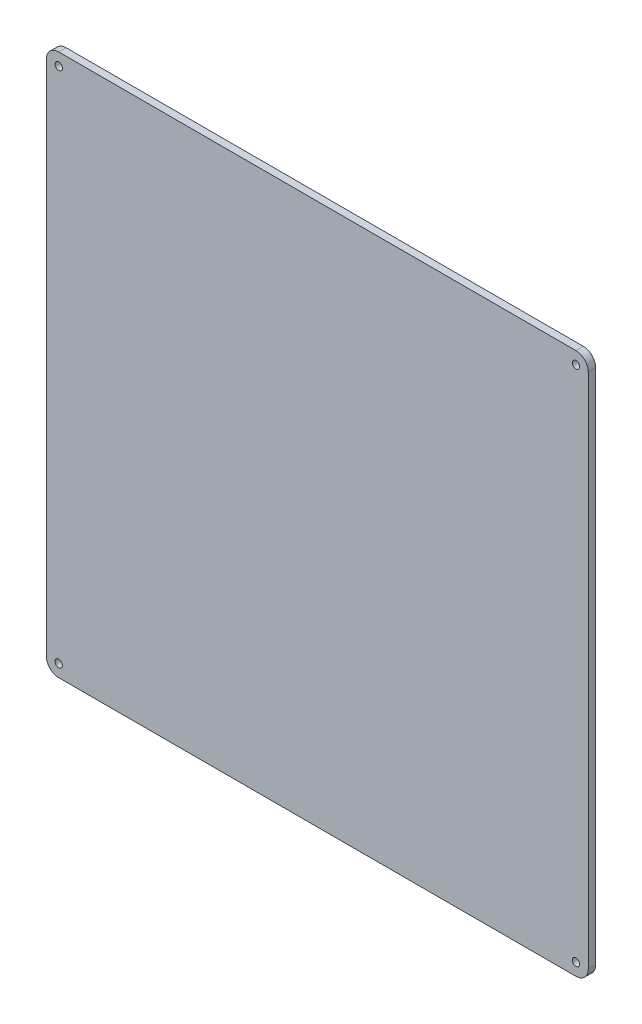
ISO-10303-21;
HEADER;
FILE_DESCRIPTION(('STEP AP214'),'2;1');
FILE_NAME('part.step','',(''),(''),'','','');
FILE_SCHEMA(('AUTOMOTIVE_DESIGN { 1 0 10303 214 1 1 1 1 }'));
ENDSEC;
DATA;
#1=APPLICATION_CONTEXT('core data for automotive mechanical design processes');
#2=APPLICATION_PROTOCOL_DEFINITION('international standard','automotive_design',2000,#1);
#3=PRODUCT_CONTEXT('',#1,'mechanical');
#4=PRODUCT('Part','Part','',(#3));
#5=PRODUCT_RELATED_PRODUCT_CATEGORY('part','',(#4));
#6=PRODUCT_DEFINITION_FORMATION('','',#4);
#7=PRODUCT_DEFINITION_CONTEXT('part definition',#1,'design');
#8=PRODUCT_DEFINITION('design','',#6,#7);
#9=PRODUCT_DEFINITION_SHAPE('','',#8);
#10=(LENGTH_UNIT() NAMED_UNIT(*) SI_UNIT(.MILLI.,.METRE.));
#11=(NAMED_UNIT(*) PLANE_ANGLE_UNIT() SI_UNIT($,.RADIAN.));
#12=(NAMED_UNIT(*) SI_UNIT($,.STERADIAN.) SOLID_ANGLE_UNIT());
#13=UNCERTAINTY_MEASURE_WITH_UNIT(LENGTH_MEASURE(1.E-05),#10,'distance_accuracy_value','');
#14=(GEOMETRIC_REPRESENTATION_CONTEXT(3) GLOBAL_UNCERTAINTY_ASSIGNED_CONTEXT((#13)) GLOBAL_UNIT_ASSIGNED_CONTEXT((#10,
#11,#12)) REPRESENTATION_CONTEXT('',''));
#15=CARTESIAN_POINT('',(0.,0.,0.));
#16=DIRECTION('',(0.,0.,1.));
#17=DIRECTION('',(1.,0.,0.));
#18=AXIS2_PLACEMENT_3D('',#15,#16,#17);
#19=CARTESIAN_POINT('',(110.,-110.,3.));
#20=DIRECTION('',(-1.,0.,0.));
#21=DIRECTION('',(0.,0.,1.));
#22=AXIS2_PLACEMENT_3D('',#19,#20,#21);
#23=PLANE('',#22);
#24=DIRECTION('',(0.,1.,0.));
#25=VECTOR('',#24,1.);
#26=CARTESIAN_POINT('',(110.,-110.,3.));
#27=LINE('',#26,#25);
#28=CARTESIAN_POINT('',(110.,-105.,3.));
#29=VERTEX_POINT('',#28);
#30=CARTESIAN_POINT('',(110.,105.,3.));
#31=VERTEX_POINT('',#30);
#32=EDGE_CURVE('E126',#29,#31,#27,.T.);
#33=ORIENTED_EDGE('',*,*,#32,.F.);
#34=DIRECTION('',(0.,0.,-1.));
#35=VECTOR('',#34,1.);
#36=CARTESIAN_POINT('',(110.,-105.,3.));
#37=LINE('',#36,#35);
#38=CARTESIAN_POINT('',(110.,-105.,0.));
#39=VERTEX_POINT('',#38);
#40=EDGE_CURVE('E110',#29,#39,#37,.T.);
#41=ORIENTED_EDGE('',*,*,#40,.T.);
#42=DIRECTION('',(0.,1.,0.));
#43=VECTOR('',#42,1.);
#44=CARTESIAN_POINT('',(110.,-110.,0.));
#45=LINE('',#44,#43);
#46=CARTESIAN_POINT('',(110.,105.,0.));
#47=VERTEX_POINT('',#46);
#48=EDGE_CURVE('E123',#39,#47,#45,.T.);
#49=ORIENTED_EDGE('',*,*,#48,.T.);
#50=DIRECTION('',(0.,0.,-1.));
#51=VECTOR('',#50,1.);
#52=CARTESIAN_POINT('',(110.,105.,3.));
#53=LINE('',#52,#51);
#54=EDGE_CURVE('E129',#47,#31,#53,.F.);
#55=ORIENTED_EDGE('',*,*,#54,.T.);
#56=EDGE_LOOP('',(#33,#41,#49,#55));
#57=FACE_BOUND('',#56,.T.);
#58=ADVANCED_FACE('F39',(#57),#23,.F.);
#59=CARTESIAN_POINT('',(-110.,110.,3.));
#60=DIRECTION('',(0.,-1.,0.));
#61=DIRECTION('',(0.,0.,-1.));
#62=AXIS2_PLACEMENT_3D('',#59,#60,#61);
#63=PLANE('',#62);
#64=DIRECTION('',(-1.,0.,0.));
#65=VECTOR('',#64,1.);
#66=CARTESIAN_POINT('',(-110.,110.,3.));
#67=LINE('',#66,#65);
#68=CARTESIAN_POINT('',(105.,110.,3.));
#69=VERTEX_POINT('',#68);
#70=CARTESIAN_POINT('',(-105.,110.,3.));
#71=VERTEX_POINT('',#70);
#72=EDGE_CURVE('E191',#69,#71,#67,.T.);
#73=ORIENTED_EDGE('',*,*,#72,.F.);
#74=DIRECTION('',(0.,0.,-1.));
#75=VECTOR('',#74,1.);
#76=CARTESIAN_POINT('',(105.,110.,3.));
#77=LINE('',#76,#75);
#78=CARTESIAN_POINT('',(105.,110.,0.));
#79=VERTEX_POINT('',#78);
#80=EDGE_CURVE('E182',#69,#79,#77,.T.);
#81=ORIENTED_EDGE('',*,*,#80,.T.);
#82=DIRECTION('',(-1.,0.,0.));
#83=VECTOR('',#82,1.);
#84=CARTESIAN_POINT('',(-110.,110.,0.));
#85=LINE('',#84,#83);
#86=CARTESIAN_POINT('',(-105.,110.,0.));
#87=VERTEX_POINT('',#86);
#88=EDGE_CURVE('E134',#79,#87,#85,.T.);
#89=ORIENTED_EDGE('',*,*,#88,.T.);
#90=DIRECTION('',(0.,0.,-1.));
#91=VECTOR('',#90,1.);
#92=CARTESIAN_POINT('',(-105.,110.,3.));
#93=LINE('',#92,#91);
#94=EDGE_CURVE('E179',#87,#71,#93,.F.);
#95=ORIENTED_EDGE('',*,*,#94,.T.);
#96=EDGE_LOOP('',(#73,#81,#89,#95));
#97=FACE_BOUND('',#96,.T.);
#98=ADVANCED_FACE('F258',(#97),#63,.F.);
#99=CARTESIAN_POINT('',(-110.,-110.,3.));
#100=DIRECTION('',(1.,0.,0.));
#101=DIRECTION('',(0.,0.,-1.));
#102=AXIS2_PLACEMENT_3D('',#99,#100,#101);
#103=PLANE('',#102);
#104=DIRECTION('',(0.,-1.,0.));
#105=VECTOR('',#104,1.);
#106=CARTESIAN_POINT('',(-110.,-110.,3.));
#107=LINE('',#106,#105);
#108=CARTESIAN_POINT('',(-110.,105.,3.));
#109=VERTEX_POINT('',#108);
#110=CARTESIAN_POINT('',(-110.,-105.,3.));
#111=VERTEX_POINT('',#110);
#112=EDGE_CURVE('E189',#109,#111,#107,.T.);
#113=ORIENTED_EDGE('',*,*,#112,.F.);
#114=DIRECTION('',(0.,0.,-1.));
#115=VECTOR('',#114,1.);
#116=CARTESIAN_POINT('',(-110.,105.,3.));
#117=LINE('',#116,#115);
#118=CARTESIAN_POINT('',(-110.,105.,0.));
#119=VERTEX_POINT('',#118);
#120=EDGE_CURVE('E11',#109,#119,#117,.T.);
#121=ORIENTED_EDGE('',*,*,#120,.T.);
#122=DIRECTION('',(0.,-1.,0.));
#123=VECTOR('',#122,1.);
#124=CARTESIAN_POINT('',(-110.,-110.,0.));
#125=LINE('',#124,#123);
#126=CARTESIAN_POINT('',(-110.,-105.,0.));
#127=VERTEX_POINT('',#126);
#128=EDGE_CURVE('E140',#119,#127,#125,.T.);
#129=ORIENTED_EDGE('',*,*,#128,.T.);
#130=DIRECTION('',(0.,0.,-1.));
#131=VECTOR('',#130,1.);
#132=CARTESIAN_POINT('',(-110.,-105.,3.));
#133=LINE('',#132,#131);
#134=EDGE_CURVE('E48',#127,#111,#133,.F.);
#135=ORIENTED_EDGE('',*,*,#134,.T.);
#136=EDGE_LOOP('',(#113,#121,#129,#135));
#137=FACE_BOUND('',#136,.T.);
#138=ADVANCED_FACE('F251',(#137),#103,.F.);
#139=CARTESIAN_POINT('',(-110.,-110.,3.));
#140=DIRECTION('',(0.,1.,0.));
#141=DIRECTION('',(0.,0.,1.));
#142=AXIS2_PLACEMENT_3D('',#139,#140,#141);
#143=PLANE('',#142);
#144=DIRECTION('',(1.,0.,0.));
#145=VECTOR('',#144,1.);
#146=CARTESIAN_POINT('',(-110.,-110.,0.));
#147=LINE('',#146,#145);
#148=CARTESIAN_POINT('',(-105.,-110.,0.));
#149=VERTEX_POINT('',#148);
#150=CARTESIAN_POINT('',(105.,-110.,0.));
#151=VERTEX_POINT('',#150);
#152=EDGE_CURVE('E151',#149,#151,#147,.T.);
#153=ORIENTED_EDGE('',*,*,#152,.T.);
#154=DIRECTION('',(0.,0.,-1.));
#155=VECTOR('',#154,1.);
#156=CARTESIAN_POINT('',(105.,-110.,3.));
#157=LINE('',#156,#155);
#158=CARTESIAN_POINT('',(105.,-110.,3.));
#159=VERTEX_POINT('',#158);
#160=EDGE_CURVE('E111',#151,#159,#157,.F.);
#161=ORIENTED_EDGE('',*,*,#160,.T.);
#162=DIRECTION('',(1.,0.,0.));
#163=VECTOR('',#162,1.);
#164=CARTESIAN_POINT('',(-110.,-110.,3.));
#165=LINE('',#164,#163);
#166=CARTESIAN_POINT('',(-105.,-110.,3.));
#167=VERTEX_POINT('',#166);
#168=EDGE_CURVE('E146',#167,#159,#165,.T.);
#169=ORIENTED_EDGE('',*,*,#168,.F.);
#170=DIRECTION('',(0.,0.,-1.));
#171=VECTOR('',#170,1.);
#172=CARTESIAN_POINT('',(-105.,-110.,3.));
#173=LINE('',#172,#171);
#174=EDGE_CURVE('E117',#167,#149,#173,.T.);
#175=ORIENTED_EDGE('',*,*,#174,.T.);
#176=EDGE_LOOP('',(#153,#161,#169,#175));
#177=FACE_BOUND('',#176,.T.);
#178=ADVANCED_FACE('F242',(#177),#143,.F.);
#179=CARTESIAN_POINT('',(0.,0.,3.));
#180=DIRECTION('',(0.,0.,-1.));
#181=DIRECTION('',(-1.,0.,0.));
#182=AXIS2_PLACEMENT_3D('',#179,#180,#181);
#183=PLANE('',#182);
#184=CARTESIAN_POINT('',(105.,-105.,3.));
#185=DIRECTION('',(0.,0.,-1.));
#186=DIRECTION('',(-1.,0.,0.));
#187=AXIS2_PLACEMENT_3D('',#184,#185,#186);
#188=CIRCLE('',#187,1.5);
#189=CARTESIAN_POINT('',(103.5,-105.,3.));
#190=VERTEX_POINT('',#189);
#191=EDGE_CURVE('E201',#190,#190,#188,.F.);
#192=ORIENTED_EDGE('',*,*,#191,.F.);
#193=EDGE_LOOP('',(#192));
#194=FACE_BOUND('',#193,.T.);
#195=CARTESIAN_POINT('',(105.,105.,3.));
#196=DIRECTION('',(0.,0.,-1.));
#197=DIRECTION('',(-1.,0.,0.));
#198=AXIS2_PLACEMENT_3D('',#195,#196,#197);
#199=CIRCLE('',#198,1.5);
#200=CARTESIAN_POINT('',(103.5,105.,3.));
#201=VERTEX_POINT('',#200);
#202=EDGE_CURVE('E210',#201,#201,#199,.F.);
#203=ORIENTED_EDGE('',*,*,#202,.F.);
#204=EDGE_LOOP('',(#203));
#205=FACE_BOUND('',#204,.T.);
#206=CARTESIAN_POINT('',(-105.,105.,3.));
#207=DIRECTION('',(0.,0.,-1.));
#208=DIRECTION('',(-1.,0.,0.));
#209=AXIS2_PLACEMENT_3D('',#206,#207,#208);
#210=CIRCLE('',#209,1.5);
#211=CARTESIAN_POINT('',(-106.5,105.,3.));
#212=VERTEX_POINT('',#211);
#213=EDGE_CURVE('E200',#212,#212,#210,.F.);
#214=ORIENTED_EDGE('',*,*,#213,.F.);
#215=EDGE_LOOP('',(#214));
#216=FACE_BOUND('',#215,.T.);
#217=CARTESIAN_POINT('',(-105.,-105.,3.));
#218=DIRECTION('',(0.,0.,-1.));
#219=DIRECTION('',(-1.,0.,0.));
#220=AXIS2_PLACEMENT_3D('',#217,#218,#219);
#221=CIRCLE('',#220,1.5);
#222=CARTESIAN_POINT('',(-106.5,-105.,3.));
#223=VERTEX_POINT('',#222);
#224=EDGE_CURVE('E135',#223,#223,#221,.F.);
#225=ORIENTED_EDGE('',*,*,#224,.F.);
#226=EDGE_LOOP('',(#225));
#227=FACE_BOUND('',#226,.T.);
#228=ORIENTED_EDGE('',*,*,#168,.T.);
#229=CARTESIAN_POINT('',(105.,-105.,3.));
#230=DIRECTION('',(0.,0.,-1.));
#231=DIRECTION('',(-1.,0.,0.));
#232=AXIS2_PLACEMENT_3D('',#229,#230,#231);
#233=CIRCLE('',#232,5.);
#234=EDGE_CURVE('E176',#159,#29,#233,.F.);
#235=ORIENTED_EDGE('',*,*,#234,.T.);
#236=ORIENTED_EDGE('',*,*,#32,.T.);
#237=CARTESIAN_POINT('',(105.,105.,3.));
#238=DIRECTION('',(0.,0.,-1.));
#239=DIRECTION('',(-1.,0.,0.));
#240=AXIS2_PLACEMENT_3D('',#237,#238,#239);
#241=CIRCLE('',#240,5.);
#242=EDGE_CURVE('E173',#31,#69,#241,.F.);
#243=ORIENTED_EDGE('',*,*,#242,.T.);
#244=ORIENTED_EDGE('',*,*,#72,.T.);
#245=CARTESIAN_POINT('',(-105.,105.,3.));
#246=DIRECTION('',(0.,0.,-1.));
#247=DIRECTION('',(-1.,0.,0.));
#248=AXIS2_PLACEMENT_3D('',#245,#246,#247);
#249=CIRCLE('',#248,5.);
#250=EDGE_CURVE('E61',#71,#109,#249,.F.);
#251=ORIENTED_EDGE('',*,*,#250,.T.);
#252=ORIENTED_EDGE('',*,*,#112,.T.);
#253=CARTESIAN_POINT('',(-105.,-105.,3.));
#254=DIRECTION('',(0.,0.,-1.));
#255=DIRECTION('',(-1.,0.,0.));
#256=AXIS2_PLACEMENT_3D('',#253,#254,#255);
#257=CIRCLE('',#256,5.);
#258=EDGE_CURVE('E168',#111,#167,#257,.F.);
#259=ORIENTED_EDGE('',*,*,#258,.T.);
#260=EDGE_LOOP('',(#228,#235,#236,#243,#244,#251,#252,#259));
#261=FACE_BOUND('',#260,.T.);
#262=ADVANCED_FACE('F231',(#194,#205,#216,#227,#261),#183,.F.);
#263=CARTESIAN_POINT('',(0.,0.,0.));
#264=DIRECTION('',(0.,0.,-1.));
#265=DIRECTION('',(-1.,0.,0.));
#266=AXIS2_PLACEMENT_3D('',#263,#264,#265);
#267=PLANE('',#266);
#268=CARTESIAN_POINT('',(105.,-105.,0.));
#269=DIRECTION('',(0.,0.,-1.));
#270=DIRECTION('',(-1.,0.,0.));
#271=AXIS2_PLACEMENT_3D('',#268,#269,#270);
#272=CIRCLE('',#271,1.5);
#273=CARTESIAN_POINT('',(103.5,-105.,0.));
#274=VERTEX_POINT('',#273);
#275=EDGE_CURVE('E206',#274,#274,#272,.T.);
#276=ORIENTED_EDGE('',*,*,#275,.F.);
#277=EDGE_LOOP('',(#276));
#278=FACE_BOUND('',#277,.T.);
#279=CARTESIAN_POINT('',(105.,105.,0.));
#280=DIRECTION('',(0.,0.,-1.));
#281=DIRECTION('',(-1.,0.,0.));
#282=AXIS2_PLACEMENT_3D('',#279,#280,#281);
#283=CIRCLE('',#282,1.5);
#284=CARTESIAN_POINT('',(103.5,105.,0.));
#285=VERTEX_POINT('',#284);
#286=EDGE_CURVE('E205',#285,#285,#283,.T.);
#287=ORIENTED_EDGE('',*,*,#286,.F.);
#288=EDGE_LOOP('',(#287));
#289=FACE_BOUND('',#288,.T.);
#290=CARTESIAN_POINT('',(-105.,105.,0.));
#291=DIRECTION('',(0.,0.,-1.));
#292=DIRECTION('',(-1.,0.,0.));
#293=AXIS2_PLACEMENT_3D('',#290,#291,#292);
#294=CIRCLE('',#293,1.5);
#295=CARTESIAN_POINT('',(-106.5,105.,0.));
#296=VERTEX_POINT('',#295);
#297=EDGE_CURVE('E214',#296,#296,#294,.T.);
#298=ORIENTED_EDGE('',*,*,#297,.F.);
#299=EDGE_LOOP('',(#298));
#300=FACE_BOUND('',#299,.T.);
#301=CARTESIAN_POINT('',(-105.,-105.,0.));
#302=DIRECTION('',(0.,0.,-1.));
#303=DIRECTION('',(-1.,0.,0.));
#304=AXIS2_PLACEMENT_3D('',#301,#302,#303);
#305=CIRCLE('',#304,1.5);
#306=CARTESIAN_POINT('',(-106.5,-105.,0.));
#307=VERTEX_POINT('',#306);
#308=EDGE_CURVE('E143',#307,#307,#305,.T.);
#309=ORIENTED_EDGE('',*,*,#308,.F.);
#310=EDGE_LOOP('',(#309));
#311=FACE_BOUND('',#310,.T.);
#312=ORIENTED_EDGE('',*,*,#48,.F.);
#313=CARTESIAN_POINT('',(105.,-105.,0.));
#314=DIRECTION('',(0.,0.,-1.));
#315=DIRECTION('',(-1.,0.,0.));
#316=AXIS2_PLACEMENT_3D('',#313,#314,#315);
#317=CIRCLE('',#316,5.);
#318=EDGE_CURVE('E106',#39,#151,#317,.T.);
#319=ORIENTED_EDGE('',*,*,#318,.T.);
#320=ORIENTED_EDGE('',*,*,#152,.F.);
#321=CARTESIAN_POINT('',(-105.,-105.,0.));
#322=DIRECTION('',(0.,0.,-1.));
#323=DIRECTION('',(-1.,0.,0.));
#324=AXIS2_PLACEMENT_3D('',#321,#322,#323);
#325=CIRCLE('',#324,5.);
#326=EDGE_CURVE('E128',#149,#127,#325,.T.);
#327=ORIENTED_EDGE('',*,*,#326,.T.);
#328=ORIENTED_EDGE('',*,*,#128,.F.);
#329=CARTESIAN_POINT('',(-105.,105.,0.));
#330=DIRECTION('',(0.,0.,-1.));
#331=DIRECTION('',(-1.,0.,0.));
#332=AXIS2_PLACEMENT_3D('',#329,#330,#331);
#333=CIRCLE('',#332,5.);
#334=EDGE_CURVE('E158',#119,#87,#333,.T.);
#335=ORIENTED_EDGE('',*,*,#334,.T.);
#336=ORIENTED_EDGE('',*,*,#88,.F.);
#337=CARTESIAN_POINT('',(105.,105.,0.));
#338=DIRECTION('',(0.,0.,-1.));
#339=DIRECTION('',(-1.,0.,0.));
#340=AXIS2_PLACEMENT_3D('',#337,#338,#339);
#341=CIRCLE('',#340,5.);
#342=EDGE_CURVE('E118',#79,#47,#341,.T.);
#343=ORIENTED_EDGE('',*,*,#342,.T.);
#344=EDGE_LOOP('',(#312,#319,#320,#327,#328,#335,#336,#343));
#345=FACE_BOUND('',#344,.T.);
#346=ADVANCED_FACE('F131',(#278,#289,#300,#311,#345),#267,.T.);
#347=CARTESIAN_POINT('',(-105.,-105.,3.001));
#348=DIRECTION('',(0.,0.,-1.));
#349=DIRECTION('',(-1.,0.,0.));
#350=AXIS2_PLACEMENT_3D('',#347,#348,#349);
#351=CYLINDRICAL_SURFACE('',#350,1.5);
#352=CARTESIAN_POINT('',(-106.5,-105.,0.));
#353=CARTESIAN_POINT('',(-106.5,-105.,0.0312500000000005));
#354=CARTESIAN_POINT('',(-106.5,-105.,0.0625000000000005));
#355=CARTESIAN_POINT('',(-106.5,-105.,0.125000000000001));
#356=CARTESIAN_POINT('',(-106.5,-105.,0.156250000000001));
#357=CARTESIAN_POINT('',(-106.5,-105.,0.218750000000001));
#358=CARTESIAN_POINT('',(-106.5,-105.,0.250000000000001));
#359=CARTESIAN_POINT('',(-106.5,-105.,0.312500000000001));
#360=CARTESIAN_POINT('',(-106.5,-105.,0.34375));
#361=CARTESIAN_POINT('',(-106.5,-105.,0.40625));
#362=CARTESIAN_POINT('',(-106.5,-105.,0.4375));
#363=CARTESIAN_POINT('',(-106.5,-105.,0.5));
#364=CARTESIAN_POINT('',(-106.5,-105.,0.53125));
#365=CARTESIAN_POINT('',(-106.5,-105.,0.593750000000001));
#366=CARTESIAN_POINT('',(-106.5,-105.,0.625000000000001));
#367=CARTESIAN_POINT('',(-106.5,-105.,0.687500000000001));
#368=CARTESIAN_POINT('',(-106.5,-105.,0.71875));
#369=CARTESIAN_POINT('',(-106.5,-105.,0.78125));
#370=CARTESIAN_POINT('',(-106.5,-105.,0.8125));
#371=CARTESIAN_POINT('',(-106.5,-105.,0.875));
#372=CARTESIAN_POINT('',(-106.5,-105.,0.90625));
#373=CARTESIAN_POINT('',(-106.5,-105.,0.96875));
#374=CARTESIAN_POINT('',(-106.5,-105.,1.));
#375=CARTESIAN_POINT('',(-106.5,-105.,1.0625));
#376=CARTESIAN_POINT('',(-106.5,-105.,1.09375));
#377=CARTESIAN_POINT('',(-106.5,-105.,1.15625));
#378=CARTESIAN_POINT('',(-106.5,-105.,1.1875));
#379=CARTESIAN_POINT('',(-106.5,-105.,1.25));
#380=CARTESIAN_POINT('',(-106.5,-105.,1.28125));
#381=CARTESIAN_POINT('',(-106.5,-105.,1.34375));
#382=CARTESIAN_POINT('',(-106.5,-105.,1.375));
#383=CARTESIAN_POINT('',(-106.5,-105.,1.4375));
#384=CARTESIAN_POINT('',(-106.5,-105.,1.46875));
#385=CARTESIAN_POINT('',(-106.5,-105.,1.53125));
#386=CARTESIAN_POINT('',(-106.5,-105.,1.5625));
#387=CARTESIAN_POINT('',(-106.5,-105.,1.625));
#388=CARTESIAN_POINT('',(-106.5,-105.,1.65625));
#389=CARTESIAN_POINT('',(-106.5,-105.,1.71875));
#390=CARTESIAN_POINT('',(-106.5,-105.,1.75));
#391=CARTESIAN_POINT('',(-106.5,-105.,1.8125));
#392=CARTESIAN_POINT('',(-106.5,-105.,1.84375));
#393=CARTESIAN_POINT('',(-106.5,-105.,1.90625));
#394=CARTESIAN_POINT('',(-106.5,-105.,1.9375));
#395=CARTESIAN_POINT('',(-106.5,-105.,2.));
#396=CARTESIAN_POINT('',(-106.5,-105.,2.03125));
#397=CARTESIAN_POINT('',(-106.5,-105.,2.09375));
#398=CARTESIAN_POINT('',(-106.5,-105.,2.125));
#399=CARTESIAN_POINT('',(-106.5,-105.,2.1875));
#400=CARTESIAN_POINT('',(-106.5,-105.,2.21875));
#401=CARTESIAN_POINT('',(-106.5,-105.,2.28125));
#402=CARTESIAN_POINT('',(-106.5,-105.,2.3125));
#403=CARTESIAN_POINT('',(-106.5,-105.,2.375));
#404=CARTESIAN_POINT('',(-106.5,-105.,2.40625));
#405=CARTESIAN_POINT('',(-106.5,-105.,2.46875));
#406=CARTESIAN_POINT('',(-106.5,-105.,2.5));
#407=CARTESIAN_POINT('',(-106.5,-105.,2.5625));
#408=CARTESIAN_POINT('',(-106.5,-105.,2.59375));
#409=CARTESIAN_POINT('',(-106.5,-105.,2.65625));
#410=CARTESIAN_POINT('',(-106.5,-105.,2.6875));
#411=CARTESIAN_POINT('',(-106.5,-105.,2.75));
#412=CARTESIAN_POINT('',(-106.5,-105.,2.78125));
#413=CARTESIAN_POINT('',(-106.5,-105.,2.84375));
#414=CARTESIAN_POINT('',(-106.5,-105.,2.875));
#415=CARTESIAN_POINT('',(-106.5,-105.,2.9375));
#416=CARTESIAN_POINT('',(-106.5,-105.,2.96875));
#417=CARTESIAN_POINT('',(-106.5,-105.,3.));
#418=B_SPLINE_CURVE_WITH_KNOTS('',3,(#352,#353,#354,#355,#356,#357,#358,#359,#360,#361,#362,
#363,#364,#365,#366,#367,#368,#369,#370,#371,#372,#373,#374,#375,#376,#377,#378,#379,#380,#381,
#382,#383,#384,#385,#386,#387,#388,#389,#390,#391,#392,#393,#394,#395,#396,#397,#398,#399,#400,
#401,#402,#403,#404,#405,#406,#407,#408,#409,#410,#411,#412,#413,#414,#415,#416,#417),
.UNSPECIFIED.,.F.,.F.,(4,2,2,2,2,2,2,2,2,2,2,2,2,2,2,2,2,2,2,2,2,2,2,2,2,2,2,2,2,2,2,2,4),(0.,
0.0937500000000001,0.1875,0.28125,0.375,0.46875,0.5625,0.65625,0.75,0.84375,0.9375,1.03125,
1.125,1.21875,1.3125,1.40625,1.5,1.59375,1.6875,1.78125,1.875,1.96875,2.0625,2.15625,2.25,
2.34375,2.4375,2.53125,2.625,2.71875,2.8125,2.90625,3.),.UNSPECIFIED.);
#419=EDGE_CURVE('BSEAM230',#307,#223,#418,.T.);
#420=ORIENTED_EDGE('',*,*,#308,.T.);
#421=ORIENTED_EDGE('',*,*,#224,.T.);
#422=ORIENTED_EDGE('',*,*,#419,.T.);
#423=ORIENTED_EDGE('',*,*,#419,.F.);
#424=EDGE_LOOP('',(#420,#422,#421,#423));
#425=FACE_BOUND('',#424,.T.);
#426=ADVANCED_FACE('F230',(#425),#351,.F.);
#427=CARTESIAN_POINT('',(-105.,105.,3.001));
#428=DIRECTION('',(0.,0.,-1.));
#429=DIRECTION('',(-1.,0.,0.));
#430=AXIS2_PLACEMENT_3D('',#427,#428,#429);
#431=CYLINDRICAL_SURFACE('',#430,1.5);
#432=CARTESIAN_POINT('',(-106.5,105.,0.));
#433=CARTESIAN_POINT('',(-106.5,105.,0.0312500000000005));
#434=CARTESIAN_POINT('',(-106.5,105.,0.0625000000000005));
#435=CARTESIAN_POINT('',(-106.5,105.,0.125000000000001));
#436=CARTESIAN_POINT('',(-106.5,105.,0.156250000000001));
#437=CARTESIAN_POINT('',(-106.5,105.,0.218750000000001));
#438=CARTESIAN_POINT('',(-106.5,105.,0.250000000000001));
#439=CARTESIAN_POINT('',(-106.5,105.,0.312500000000001));
#440=CARTESIAN_POINT('',(-106.5,105.,0.34375));
#441=CARTESIAN_POINT('',(-106.5,105.,0.40625));
#442=CARTESIAN_POINT('',(-106.5,105.,0.4375));
#443=CARTESIAN_POINT('',(-106.5,105.,0.5));
#444=CARTESIAN_POINT('',(-106.5,105.,0.53125));
#445=CARTESIAN_POINT('',(-106.5,105.,0.593750000000001));
#446=CARTESIAN_POINT('',(-106.5,105.,0.625000000000001));
#447=CARTESIAN_POINT('',(-106.5,105.,0.687500000000001));
#448=CARTESIAN_POINT('',(-106.5,105.,0.71875));
#449=CARTESIAN_POINT('',(-106.5,105.,0.78125));
#450=CARTESIAN_POINT('',(-106.5,105.,0.8125));
#451=CARTESIAN_POINT('',(-106.5,105.,0.875));
#452=CARTESIAN_POINT('',(-106.5,105.,0.90625));
#453=CARTESIAN_POINT('',(-106.5,105.,0.96875));
#454=CARTESIAN_POINT('',(-106.5,105.,1.));
#455=CARTESIAN_POINT('',(-106.5,105.,1.0625));
#456=CARTESIAN_POINT('',(-106.5,105.,1.09375));
#457=CARTESIAN_POINT('',(-106.5,105.,1.15625));
#458=CARTESIAN_POINT('',(-106.5,105.,1.1875));
#459=CARTESIAN_POINT('',(-106.5,105.,1.25));
#460=CARTESIAN_POINT('',(-106.5,105.,1.28125));
#461=CARTESIAN_POINT('',(-106.5,105.,1.34375));
#462=CARTESIAN_POINT('',(-106.5,105.,1.375));
#463=CARTESIAN_POINT('',(-106.5,105.,1.4375));
#464=CARTESIAN_POINT('',(-106.5,105.,1.46875));
#465=CARTESIAN_POINT('',(-106.5,105.,1.53125));
#466=CARTESIAN_POINT('',(-106.5,105.,1.5625));
#467=CARTESIAN_POINT('',(-106.5,105.,1.625));
#468=CARTESIAN_POINT('',(-106.5,105.,1.65625));
#469=CARTESIAN_POINT('',(-106.5,105.,1.71875));
#470=CARTESIAN_POINT('',(-106.5,105.,1.75));
#471=CARTESIAN_POINT('',(-106.5,105.,1.8125));
#472=CARTESIAN_POINT('',(-106.5,105.,1.84375));
#473=CARTESIAN_POINT('',(-106.5,105.,1.90625));
#474=CARTESIAN_POINT('',(-106.5,105.,1.9375));
#475=CARTESIAN_POINT('',(-106.5,105.,2.));
#476=CARTESIAN_POINT('',(-106.5,105.,2.03125));
#477=CARTESIAN_POINT('',(-106.5,105.,2.09375));
#478=CARTESIAN_POINT('',(-106.5,105.,2.125));
#479=CARTESIAN_POINT('',(-106.5,105.,2.1875));
#480=CARTESIAN_POINT('',(-106.5,105.,2.21875));
#481=CARTESIAN_POINT('',(-106.5,105.,2.28125));
#482=CARTESIAN_POINT('',(-106.5,105.,2.3125));
#483=CARTESIAN_POINT('',(-106.5,105.,2.375));
#484=CARTESIAN_POINT('',(-106.5,105.,2.40625));
#485=CARTESIAN_POINT('',(-106.5,105.,2.46875));
#486=CARTESIAN_POINT('',(-106.5,105.,2.5));
#487=CARTESIAN_POINT('',(-106.5,105.,2.5625));
#488=CARTESIAN_POINT('',(-106.5,105.,2.59375));
#489=CARTESIAN_POINT('',(-106.5,105.,2.65625));
#490=CARTESIAN_POINT('',(-106.5,105.,2.6875));
#491=CARTESIAN_POINT('',(-106.5,105.,2.75));
#492=CARTESIAN_POINT('',(-106.5,105.,2.78125));
#493=CARTESIAN_POINT('',(-106.5,105.,2.84375));
#494=CARTESIAN_POINT('',(-106.5,105.,2.875));
#495=CARTESIAN_POINT('',(-106.5,105.,2.9375));
#496=CARTESIAN_POINT('',(-106.5,105.,2.96875));
#497=CARTESIAN_POINT('',(-106.5,105.,3.));
#498=B_SPLINE_CURVE_WITH_KNOTS('',3,(#432,#433,#434,#435,#436,#437,#438,#439,#440,#441,#442,
#443,#444,#445,#446,#447,#448,#449,#450,#451,#452,#453,#454,#455,#456,#457,#458,#459,#460,#461,
#462,#463,#464,#465,#466,#467,#468,#469,#470,#471,#472,#473,#474,#475,#476,#477,#478,#479,#480,
#481,#482,#483,#484,#485,#486,#487,#488,#489,#490,#491,#492,#493,#494,#495,#496,#497),
.UNSPECIFIED.,.F.,.F.,(4,2,2,2,2,2,2,2,2,2,2,2,2,2,2,2,2,2,2,2,2,2,2,2,2,2,2,2,2,2,2,2,4),(0.,
0.0937500000000001,0.1875,0.28125,0.375,0.46875,0.5625,0.65625,0.75,0.84375,0.9375,1.03125,
1.125,1.21875,1.3125,1.40625,1.5,1.59375,1.6875,1.78125,1.875,1.96875,2.0625,2.15625,2.25,
2.34375,2.4375,2.53125,2.625,2.71875,2.8125,2.90625,3.),.UNSPECIFIED.);
#499=EDGE_CURVE('BSEAM225',#296,#212,#498,.T.);
#500=ORIENTED_EDGE('',*,*,#297,.T.);
#501=ORIENTED_EDGE('',*,*,#213,.T.);
#502=ORIENTED_EDGE('',*,*,#499,.T.);
#503=ORIENTED_EDGE('',*,*,#499,.F.);
#504=EDGE_LOOP('',(#500,#502,#501,#503));
#505=FACE_BOUND('',#504,.T.);
#506=ADVANCED_FACE('F225',(#505),#431,.F.);
#507=CARTESIAN_POINT('',(105.,105.,3.001));
#508=DIRECTION('',(0.,0.,-1.));
#509=DIRECTION('',(-1.,0.,0.));
#510=AXIS2_PLACEMENT_3D('',#507,#508,#509);
#511=CYLINDRICAL_SURFACE('',#510,1.5);
#512=CARTESIAN_POINT('',(103.5,105.,0.));
#513=CARTESIAN_POINT('',(103.5,105.,0.0312500000000005));
#514=CARTESIAN_POINT('',(103.5,105.,0.0625000000000005));
#515=CARTESIAN_POINT('',(103.5,105.,0.125000000000001));
#516=CARTESIAN_POINT('',(103.5,105.,0.156250000000001));
#517=CARTESIAN_POINT('',(103.5,105.,0.218750000000001));
#518=CARTESIAN_POINT('',(103.5,105.,0.250000000000001));
#519=CARTESIAN_POINT('',(103.5,105.,0.312500000000001));
#520=CARTESIAN_POINT('',(103.5,105.,0.34375));
#521=CARTESIAN_POINT('',(103.5,105.,0.40625));
#522=CARTESIAN_POINT('',(103.5,105.,0.4375));
#523=CARTESIAN_POINT('',(103.5,105.,0.5));
#524=CARTESIAN_POINT('',(103.5,105.,0.53125));
#525=CARTESIAN_POINT('',(103.5,105.,0.593750000000001));
#526=CARTESIAN_POINT('',(103.5,105.,0.625000000000001));
#527=CARTESIAN_POINT('',(103.5,105.,0.687500000000001));
#528=CARTESIAN_POINT('',(103.5,105.,0.71875));
#529=CARTESIAN_POINT('',(103.5,105.,0.78125));
#530=CARTESIAN_POINT('',(103.5,105.,0.8125));
#531=CARTESIAN_POINT('',(103.5,105.,0.875));
#532=CARTESIAN_POINT('',(103.5,105.,0.90625));
#533=CARTESIAN_POINT('',(103.5,105.,0.96875));
#534=CARTESIAN_POINT('',(103.5,105.,1.));
#535=CARTESIAN_POINT('',(103.5,105.,1.0625));
#536=CARTESIAN_POINT('',(103.5,105.,1.09375));
#537=CARTESIAN_POINT('',(103.5,105.,1.15625));
#538=CARTESIAN_POINT('',(103.5,105.,1.1875));
#539=CARTESIAN_POINT('',(103.5,105.,1.25));
#540=CARTESIAN_POINT('',(103.5,105.,1.28125));
#541=CARTESIAN_POINT('',(103.5,105.,1.34375));
#542=CARTESIAN_POINT('',(103.5,105.,1.375));
#543=CARTESIAN_POINT('',(103.5,105.,1.4375));
#544=CARTESIAN_POINT('',(103.5,105.,1.46875));
#545=CARTESIAN_POINT('',(103.5,105.,1.53125));
#546=CARTESIAN_POINT('',(103.5,105.,1.5625));
#547=CARTESIAN_POINT('',(103.5,105.,1.625));
#548=CARTESIAN_POINT('',(103.5,105.,1.65625));
#549=CARTESIAN_POINT('',(103.5,105.,1.71875));
#550=CARTESIAN_POINT('',(103.5,105.,1.75));
#551=CARTESIAN_POINT('',(103.5,105.,1.8125));
#552=CARTESIAN_POINT('',(103.5,105.,1.84375));
#553=CARTESIAN_POINT('',(103.5,105.,1.90625));
#554=CARTESIAN_POINT('',(103.5,105.,1.9375));
#555=CARTESIAN_POINT('',(103.5,105.,2.));
#556=CARTESIAN_POINT('',(103.5,105.,2.03125));
#557=CARTESIAN_POINT('',(103.5,105.,2.09375));
#558=CARTESIAN_POINT('',(103.5,105.,2.125));
#559=CARTESIAN_POINT('',(103.5,105.,2.1875));
#560=CARTESIAN_POINT('',(103.5,105.,2.21875));
#561=CARTESIAN_POINT('',(103.5,105.,2.28125));
#562=CARTESIAN_POINT('',(103.5,105.,2.3125));
#563=CARTESIAN_POINT('',(103.5,105.,2.375));
#564=CARTESIAN_POINT('',(103.5,105.,2.40625));
#565=CARTESIAN_POINT('',(103.5,105.,2.46875));
#566=CARTESIAN_POINT('',(103.5,105.,2.5));
#567=CARTESIAN_POINT('',(103.5,105.,2.5625));
#568=CARTESIAN_POINT('',(103.5,105.,2.59375));
#569=CARTESIAN_POINT('',(103.5,105.,2.65625));
#570=CARTESIAN_POINT('',(103.5,105.,2.6875));
#571=CARTESIAN_POINT('',(103.5,105.,2.75));
#572=CARTESIAN_POINT('',(103.5,105.,2.78125));
#573=CARTESIAN_POINT('',(103.5,105.,2.84375));
#574=CARTESIAN_POINT('',(103.5,105.,2.875));
#575=CARTESIAN_POINT('',(103.5,105.,2.9375));
#576=CARTESIAN_POINT('',(103.5,105.,2.96875));
#577=CARTESIAN_POINT('',(103.5,105.,3.));
#578=B_SPLINE_CURVE_WITH_KNOTS('',3,(#512,#513,#514,#515,#516,#517,#518,#519,#520,#521,#522,
#523,#524,#525,#526,#527,#528,#529,#530,#531,#532,#533,#534,#535,#536,#537,#538,#539,#540,#541,
#542,#543,#544,#545,#546,#547,#548,#549,#550,#551,#552,#553,#554,#555,#556,#557,#558,#559,#560,
#561,#562,#563,#564,#565,#566,#567,#568,#569,#570,#571,#572,#573,#574,#575,#576,#577),
.UNSPECIFIED.,.F.,.F.,(4,2,2,2,2,2,2,2,2,2,2,2,2,2,2,2,2,2,2,2,2,2,2,2,2,2,2,2,2,2,2,2,4),(0.,
0.0937500000000001,0.1875,0.28125,0.375,0.46875,0.5625,0.65625,0.75,0.84375,0.9375,1.03125,
1.125,1.21875,1.3125,1.40625,1.5,1.59375,1.6875,1.78125,1.875,1.96875,2.0625,2.15625,2.25,
2.34375,2.4375,2.53125,2.625,2.71875,2.8125,2.90625,3.),.UNSPECIFIED.);
#579=EDGE_CURVE('BSEAM283',#285,#201,#578,.T.);
#580=ORIENTED_EDGE('',*,*,#286,.T.);
#581=ORIENTED_EDGE('',*,*,#202,.T.);
#582=ORIENTED_EDGE('',*,*,#579,.T.);
#583=ORIENTED_EDGE('',*,*,#579,.F.);
#584=EDGE_LOOP('',(#580,#582,#581,#583));
#585=FACE_BOUND('',#584,.T.);
#586=ADVANCED_FACE('F283',(#585),#511,.F.);
#587=CARTESIAN_POINT('',(105.,-105.,3.001));
#588=DIRECTION('',(0.,0.,-1.));
#589=DIRECTION('',(-1.,0.,0.));
#590=AXIS2_PLACEMENT_3D('',#587,#588,#589);
#591=CYLINDRICAL_SURFACE('',#590,1.5);
#592=CARTESIAN_POINT('',(103.5,-105.,0.));
#593=CARTESIAN_POINT('',(103.5,-105.,0.0312500000000005));
#594=CARTESIAN_POINT('',(103.5,-105.,0.0625000000000005));
#595=CARTESIAN_POINT('',(103.5,-105.,0.125000000000001));
#596=CARTESIAN_POINT('',(103.5,-105.,0.156250000000001));
#597=CARTESIAN_POINT('',(103.5,-105.,0.218750000000001));
#598=CARTESIAN_POINT('',(103.5,-105.,0.250000000000001));
#599=CARTESIAN_POINT('',(103.5,-105.,0.312500000000001));
#600=CARTESIAN_POINT('',(103.5,-105.,0.34375));
#601=CARTESIAN_POINT('',(103.5,-105.,0.40625));
#602=CARTESIAN_POINT('',(103.5,-105.,0.4375));
#603=CARTESIAN_POINT('',(103.5,-105.,0.5));
#604=CARTESIAN_POINT('',(103.5,-105.,0.53125));
#605=CARTESIAN_POINT('',(103.5,-105.,0.593750000000001));
#606=CARTESIAN_POINT('',(103.5,-105.,0.625000000000001));
#607=CARTESIAN_POINT('',(103.5,-105.,0.687500000000001));
#608=CARTESIAN_POINT('',(103.5,-105.,0.71875));
#609=CARTESIAN_POINT('',(103.5,-105.,0.78125));
#610=CARTESIAN_POINT('',(103.5,-105.,0.8125));
#611=CARTESIAN_POINT('',(103.5,-105.,0.875));
#612=CARTESIAN_POINT('',(103.5,-105.,0.90625));
#613=CARTESIAN_POINT('',(103.5,-105.,0.96875));
#614=CARTESIAN_POINT('',(103.5,-105.,1.));
#615=CARTESIAN_POINT('',(103.5,-105.,1.0625));
#616=CARTESIAN_POINT('',(103.5,-105.,1.09375));
#617=CARTESIAN_POINT('',(103.5,-105.,1.15625));
#618=CARTESIAN_POINT('',(103.5,-105.,1.1875));
#619=CARTESIAN_POINT('',(103.5,-105.,1.25));
#620=CARTESIAN_POINT('',(103.5,-105.,1.28125));
#621=CARTESIAN_POINT('',(103.5,-105.,1.34375));
#622=CARTESIAN_POINT('',(103.5,-105.,1.375));
#623=CARTESIAN_POINT('',(103.5,-105.,1.4375));
#624=CARTESIAN_POINT('',(103.5,-105.,1.46875));
#625=CARTESIAN_POINT('',(103.5,-105.,1.53125));
#626=CARTESIAN_POINT('',(103.5,-105.,1.5625));
#627=CARTESIAN_POINT('',(103.5,-105.,1.625));
#628=CARTESIAN_POINT('',(103.5,-105.,1.65625));
#629=CARTESIAN_POINT('',(103.5,-105.,1.71875));
#630=CARTESIAN_POINT('',(103.5,-105.,1.75));
#631=CARTESIAN_POINT('',(103.5,-105.,1.8125));
#632=CARTESIAN_POINT('',(103.5,-105.,1.84375));
#633=CARTESIAN_POINT('',(103.5,-105.,1.90625));
#634=CARTESIAN_POINT('',(103.5,-105.,1.9375));
#635=CARTESIAN_POINT('',(103.5,-105.,2.));
#636=CARTESIAN_POINT('',(103.5,-105.,2.03125));
#637=CARTESIAN_POINT('',(103.5,-105.,2.09375));
#638=CARTESIAN_POINT('',(103.5,-105.,2.125));
#639=CARTESIAN_POINT('',(103.5,-105.,2.1875));
#640=CARTESIAN_POINT('',(103.5,-105.,2.21875));
#641=CARTESIAN_POINT('',(103.5,-105.,2.28125));
#642=CARTESIAN_POINT('',(103.5,-105.,2.3125));
#643=CARTESIAN_POINT('',(103.5,-105.,2.375));
#644=CARTESIAN_POINT('',(103.5,-105.,2.40625));
#645=CARTESIAN_POINT('',(103.5,-105.,2.46875));
#646=CARTESIAN_POINT('',(103.5,-105.,2.5));
#647=CARTESIAN_POINT('',(103.5,-105.,2.5625));
#648=CARTESIAN_POINT('',(103.5,-105.,2.59375));
#649=CARTESIAN_POINT('',(103.5,-105.,2.65625));
#650=CARTESIAN_POINT('',(103.5,-105.,2.6875));
#651=CARTESIAN_POINT('',(103.5,-105.,2.75));
#652=CARTESIAN_POINT('',(103.5,-105.,2.78125));
#653=CARTESIAN_POINT('',(103.5,-105.,2.84375));
#654=CARTESIAN_POINT('',(103.5,-105.,2.875));
#655=CARTESIAN_POINT('',(103.5,-105.,2.9375));
#656=CARTESIAN_POINT('',(103.5,-105.,2.96875));
#657=CARTESIAN_POINT('',(103.5,-105.,3.));
#658=B_SPLINE_CURVE_WITH_KNOTS('',3,(#592,#593,#594,#595,#596,#597,#598,#599,#600,#601,#602,
#603,#604,#605,#606,#607,#608,#609,#610,#611,#612,#613,#614,#615,#616,#617,#618,#619,#620,#621,
#622,#623,#624,#625,#626,#627,#628,#629,#630,#631,#632,#633,#634,#635,#636,#637,#638,#639,#640,
#641,#642,#643,#644,#645,#646,#647,#648,#649,#650,#651,#652,#653,#654,#655,#656,#657),
.UNSPECIFIED.,.F.,.F.,(4,2,2,2,2,2,2,2,2,2,2,2,2,2,2,2,2,2,2,2,2,2,2,2,2,2,2,2,2,2,2,2,4),(0.,
0.0937500000000001,0.1875,0.28125,0.375,0.46875,0.5625,0.65625,0.75,0.84375,0.9375,1.03125,
1.125,1.21875,1.3125,1.40625,1.5,1.59375,1.6875,1.78125,1.875,1.96875,2.0625,2.15625,2.25,
2.34375,2.4375,2.53125,2.625,2.71875,2.8125,2.90625,3.),.UNSPECIFIED.);
#659=EDGE_CURVE('BSEAM268',#274,#190,#658,.T.);
#660=ORIENTED_EDGE('',*,*,#275,.T.);
#661=ORIENTED_EDGE('',*,*,#191,.T.);
#662=ORIENTED_EDGE('',*,*,#659,.T.);
#663=ORIENTED_EDGE('',*,*,#659,.F.);
#664=EDGE_LOOP('',(#660,#662,#661,#663));
#665=FACE_BOUND('',#664,.T.);
#666=ADVANCED_FACE('F268',(#665),#591,.F.);
#667=CARTESIAN_POINT('',(105.,-105.,3.));
#668=DIRECTION('',(0.,0.,-1.));
#669=DIRECTION('',(-1.,0.,0.));
#670=AXIS2_PLACEMENT_3D('',#667,#668,#669);
#671=CYLINDRICAL_SURFACE('',#670,5.);
#672=ORIENTED_EDGE('',*,*,#234,.F.);
#673=ORIENTED_EDGE('',*,*,#160,.F.);
#674=ORIENTED_EDGE('',*,*,#318,.F.);
#675=ORIENTED_EDGE('',*,*,#40,.F.);
#676=EDGE_LOOP('',(#672,#673,#674,#675));
#677=FACE_BOUND('',#676,.T.);
#678=ADVANCED_FACE('F109',(#677),#671,.T.);
#679=CARTESIAN_POINT('',(105.,105.,3.));
#680=DIRECTION('',(0.,0.,-1.));
#681=DIRECTION('',(-1.,0.,0.));
#682=AXIS2_PLACEMENT_3D('',#679,#680,#681);
#683=CYLINDRICAL_SURFACE('',#682,5.);
#684=ORIENTED_EDGE('',*,*,#242,.F.);
#685=ORIENTED_EDGE('',*,*,#54,.F.);
#686=ORIENTED_EDGE('',*,*,#342,.F.);
#687=ORIENTED_EDGE('',*,*,#80,.F.);
#688=EDGE_LOOP('',(#684,#685,#686,#687));
#689=FACE_BOUND('',#688,.T.);
#690=ADVANCED_FACE('F261',(#689),#683,.T.);
#691=CARTESIAN_POINT('',(-105.,105.,3.));
#692=DIRECTION('',(0.,0.,-1.));
#693=DIRECTION('',(-1.,0.,0.));
#694=AXIS2_PLACEMENT_3D('',#691,#692,#693);
#695=CYLINDRICAL_SURFACE('',#694,5.);
#696=ORIENTED_EDGE('',*,*,#250,.F.);
#697=ORIENTED_EDGE('',*,*,#94,.F.);
#698=ORIENTED_EDGE('',*,*,#334,.F.);
#699=ORIENTED_EDGE('',*,*,#120,.F.);
#700=EDGE_LOOP('',(#696,#697,#698,#699));
#701=FACE_BOUND('',#700,.T.);
#702=ADVANCED_FACE('F254',(#701),#695,.T.);
#703=CARTESIAN_POINT('',(-105.,-105.,3.));
#704=DIRECTION('',(0.,0.,-1.));
#705=DIRECTION('',(-1.,0.,0.));
#706=AXIS2_PLACEMENT_3D('',#703,#704,#705);
#707=CYLINDRICAL_SURFACE('',#706,5.);
#708=ORIENTED_EDGE('',*,*,#258,.F.);
#709=ORIENTED_EDGE('',*,*,#134,.F.);
#710=ORIENTED_EDGE('',*,*,#326,.F.);
#711=ORIENTED_EDGE('',*,*,#174,.F.);
#712=EDGE_LOOP('',(#708,#709,#710,#711));
#713=FACE_BOUND('',#712,.T.);
#714=ADVANCED_FACE('F41',(#713),#707,.T.);
#715=CLOSED_SHELL('',(#58,#98,#138,#178,#262,#346,#426,#506,#586,#666,#678,#690,#702,#714));
#716=MANIFOLD_SOLID_BREP('B2',#715);
#717=ADVANCED_BREP_SHAPE_REPRESENTATION('',(#18,#716),#14);
#718=SHAPE_DEFINITION_REPRESENTATION(#9,#717);
ENDSEC;
END-ISO-10303-21;
